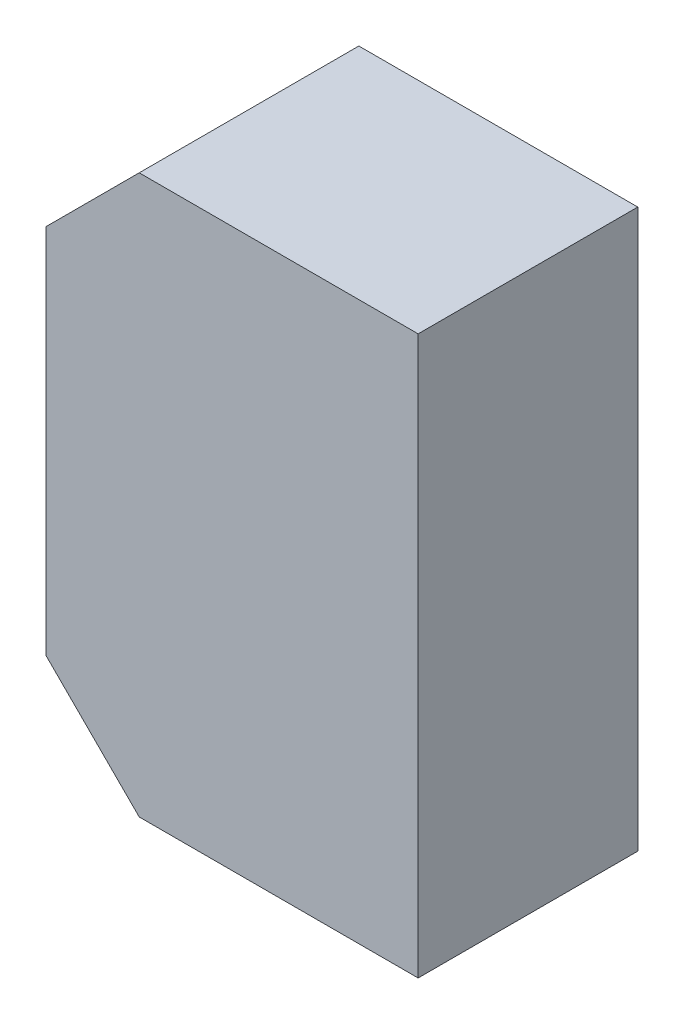
ISO-10303-21;
HEADER;
FILE_DESCRIPTION(('STEP AP214'),'2;1');
FILE_NAME('part.step','',(''),(''),'','','');
FILE_SCHEMA(('AUTOMOTIVE_DESIGN { 1 0 10303 214 1 1 1 1 }'));
ENDSEC;
DATA;
#1=APPLICATION_CONTEXT('core data for automotive mechanical design processes');
#2=APPLICATION_PROTOCOL_DEFINITION('international standard','automotive_design',2000,#1);
#3=PRODUCT_CONTEXT('',#1,'mechanical');
#4=PRODUCT('Part','Part','',(#3));
#5=PRODUCT_RELATED_PRODUCT_CATEGORY('part','',(#4));
#6=PRODUCT_DEFINITION_FORMATION('','',#4);
#7=PRODUCT_DEFINITION_CONTEXT('part definition',#1,'design');
#8=PRODUCT_DEFINITION('design','',#6,#7);
#9=PRODUCT_DEFINITION_SHAPE('','',#8);
#10=(LENGTH_UNIT() NAMED_UNIT(*) SI_UNIT(.MILLI.,.METRE.));
#11=(NAMED_UNIT(*) PLANE_ANGLE_UNIT() SI_UNIT($,.RADIAN.));
#12=(NAMED_UNIT(*) SI_UNIT($,.STERADIAN.) SOLID_ANGLE_UNIT());
#13=UNCERTAINTY_MEASURE_WITH_UNIT(LENGTH_MEASURE(1.E-05),#10,'distance_accuracy_value','');
#14=(GEOMETRIC_REPRESENTATION_CONTEXT(3) GLOBAL_UNCERTAINTY_ASSIGNED_CONTEXT((#13)) GLOBAL_UNIT_ASSIGNED_CONTEXT((#10,
#11,#12)) REPRESENTATION_CONTEXT('',''));
#15=CARTESIAN_POINT('',(0.,0.,0.));
#16=DIRECTION('',(0.,0.,1.));
#17=DIRECTION('',(1.,0.,0.));
#18=AXIS2_PLACEMENT_3D('',#15,#16,#17);
#19=CARTESIAN_POINT('',(2.54,1.27,5.));
#20=DIRECTION('',(0.,0.,-1.));
#21=DIRECTION('',(-1.,0.,0.));
#22=AXIS2_PLACEMENT_3D('',#19,#20,#21);
#23=PLANE('',#22);
#24=DIRECTION('',(0.707106781186548,0.707106781186548,0.));
#25=VECTOR('',#24,1.);
#26=CARTESIAN_POINT('',(-1.27,1.27,5.));
#27=LINE('',#26,#25);
#28=CARTESIAN_POINT('',(-1.27,1.27,5.));
#29=VERTEX_POINT('',#28);
#30=CARTESIAN_POINT('',(-2.54,0.,5.));
#31=VERTEX_POINT('',#30);
#32=EDGE_CURVE('E95',#29,#31,#27,.F.);
#33=ORIENTED_EDGE('',*,*,#32,.T.);
#34=DIRECTION('',(0.,1.,0.));
#35=VECTOR('',#34,1.);
#36=CARTESIAN_POINT('',(-2.54,0.,5.));
#37=LINE('',#36,#35);
#38=CARTESIAN_POINT('',(-2.54,-5.08,5.));
#39=VERTEX_POINT('',#38);
#40=EDGE_CURVE('E91',#31,#39,#37,.F.);
#41=ORIENTED_EDGE('',*,*,#40,.T.);
#42=DIRECTION('',(-0.707106781186548,0.707106781186548,0.));
#43=VECTOR('',#42,1.);
#44=CARTESIAN_POINT('',(-2.54,-5.08,5.));
#45=LINE('',#44,#43);
#46=CARTESIAN_POINT('',(-1.27,-6.35,5.));
#47=VERTEX_POINT('',#46);
#48=EDGE_CURVE('E67',#39,#47,#45,.F.);
#49=ORIENTED_EDGE('',*,*,#48,.T.);
#50=DIRECTION('',(1.,0.,0.));
#51=VECTOR('',#50,1.);
#52=CARTESIAN_POINT('',(-1.27,-6.35,5.));
#53=LINE('',#52,#51);
#54=CARTESIAN_POINT('',(2.54,-6.35,5.));
#55=VERTEX_POINT('',#54);
#56=EDGE_CURVE('E69',#47,#55,#53,.T.);
#57=ORIENTED_EDGE('',*,*,#56,.T.);
#58=DIRECTION('',(0.,1.,0.));
#59=VECTOR('',#58,1.);
#60=CARTESIAN_POINT('',(2.54,-6.35,5.));
#61=LINE('',#60,#59);
#62=CARTESIAN_POINT('',(2.54,1.27,5.));
#63=VERTEX_POINT('',#62);
#64=EDGE_CURVE('E19',#55,#63,#61,.T.);
#65=ORIENTED_EDGE('',*,*,#64,.T.);
#66=DIRECTION('',(1.,0.,0.));
#67=VECTOR('',#66,1.);
#68=CARTESIAN_POINT('',(2.54,1.27,5.));
#69=LINE('',#68,#67);
#70=EDGE_CURVE('E100',#63,#29,#69,.F.);
#71=ORIENTED_EDGE('',*,*,#70,.T.);
#72=EDGE_LOOP('',(#33,#41,#49,#57,#65,#71));
#73=FACE_BOUND('',#72,.T.);
#74=ADVANCED_FACE('F16',(#73),#23,.F.);
#75=CARTESIAN_POINT('',(2.54,-6.35,2.));
#76=DIRECTION('',(-1.,0.,0.));
#77=DIRECTION('',(0.,0.,1.));
#78=AXIS2_PLACEMENT_3D('',#75,#76,#77);
#79=PLANE('',#78);
#80=DIRECTION('',(0.,0.,-1.));
#81=VECTOR('',#80,1.);
#82=CARTESIAN_POINT('',(2.54,1.27,2.));
#83=LINE('',#82,#81);
#84=CARTESIAN_POINT('',(2.54,1.27,2.));
#85=VERTEX_POINT('',#84);
#86=EDGE_CURVE('E80',#85,#63,#83,.F.);
#87=ORIENTED_EDGE('',*,*,#86,.T.);
#88=ORIENTED_EDGE('',*,*,#64,.F.);
#89=DIRECTION('',(0.,0.,1.));
#90=VECTOR('',#89,1.);
#91=CARTESIAN_POINT('',(2.54,-6.35,2.));
#92=LINE('',#91,#90);
#93=CARTESIAN_POINT('',(2.54,-6.35,2.));
#94=VERTEX_POINT('',#93);
#95=EDGE_CURVE('E75',#55,#94,#92,.F.);
#96=ORIENTED_EDGE('',*,*,#95,.T.);
#97=DIRECTION('',(0.,1.,0.));
#98=VECTOR('',#97,1.);
#99=CARTESIAN_POINT('',(2.54,1.27,2.));
#100=LINE('',#99,#98);
#101=EDGE_CURVE('E103',#85,#94,#100,.F.);
#102=ORIENTED_EDGE('',*,*,#101,.F.);
#103=EDGE_LOOP('',(#87,#88,#96,#102));
#104=FACE_BOUND('',#103,.T.);
#105=ADVANCED_FACE('F77',(#104),#79,.F.);
#106=CARTESIAN_POINT('',(-1.27,-6.35,2.));
#107=DIRECTION('',(0.,1.,0.));
#108=DIRECTION('',(0.,0.,1.));
#109=AXIS2_PLACEMENT_3D('',#106,#107,#108);
#110=PLANE('',#109);
#111=ORIENTED_EDGE('',*,*,#95,.F.);
#112=ORIENTED_EDGE('',*,*,#56,.F.);
#113=DIRECTION('',(0.,0.,1.));
#114=VECTOR('',#113,1.);
#115=CARTESIAN_POINT('',(-1.27,-6.35,2.));
#116=LINE('',#115,#114);
#117=CARTESIAN_POINT('',(-1.27,-6.35,2.));
#118=VERTEX_POINT('',#117);
#119=EDGE_CURVE('E87',#47,#118,#116,.F.);
#120=ORIENTED_EDGE('',*,*,#119,.T.);
#121=DIRECTION('',(-1.,0.,0.));
#122=VECTOR('',#121,1.);
#123=CARTESIAN_POINT('',(2.54,-6.35,2.));
#124=LINE('',#123,#122);
#125=EDGE_CURVE('E84',#94,#118,#124,.T.);
#126=ORIENTED_EDGE('',*,*,#125,.F.);
#127=EDGE_LOOP('',(#111,#112,#120,#126));
#128=FACE_BOUND('',#127,.T.);
#129=ADVANCED_FACE('F82',(#128),#110,.F.);
#130=CARTESIAN_POINT('',(-2.54,-5.08,2.));
#131=DIRECTION('',(0.707106781186548,0.707106781186548,0.));
#132=DIRECTION('',(-0.707106781186548,0.707106781186548,0.));
#133=AXIS2_PLACEMENT_3D('',#130,#131,#132);
#134=PLANE('',#133);
#135=ORIENTED_EDGE('',*,*,#119,.F.);
#136=ORIENTED_EDGE('',*,*,#48,.F.);
#137=DIRECTION('',(0.,0.,-1.));
#138=VECTOR('',#137,1.);
#139=CARTESIAN_POINT('',(-2.54,-5.08,2.));
#140=LINE('',#139,#138);
#141=CARTESIAN_POINT('',(-2.54,-5.08,2.));
#142=VERTEX_POINT('',#141);
#143=EDGE_CURVE('E93',#39,#142,#140,.T.);
#144=ORIENTED_EDGE('',*,*,#143,.T.);
#145=DIRECTION('',(-0.707106781186548,0.707106781186547,0.));
#146=VECTOR('',#145,1.);
#147=CARTESIAN_POINT('',(-1.27,-6.35,2.));
#148=LINE('',#147,#146);
#149=EDGE_CURVE('E106',#118,#142,#148,.T.);
#150=ORIENTED_EDGE('',*,*,#149,.F.);
#151=EDGE_LOOP('',(#135,#136,#144,#150));
#152=FACE_BOUND('',#151,.T.);
#153=ADVANCED_FACE('F123',(#152),#134,.F.);
#154=CARTESIAN_POINT('',(-2.54,0.,2.));
#155=DIRECTION('',(1.,0.,0.));
#156=DIRECTION('',(0.,0.,-1.));
#157=AXIS2_PLACEMENT_3D('',#154,#155,#156);
#158=PLANE('',#157);
#159=ORIENTED_EDGE('',*,*,#143,.F.);
#160=ORIENTED_EDGE('',*,*,#40,.F.);
#161=DIRECTION('',(0.,0.,1.));
#162=VECTOR('',#161,1.);
#163=CARTESIAN_POINT('',(-2.54,0.,2.));
#164=LINE('',#163,#162);
#165=CARTESIAN_POINT('',(-2.54,0.,2.));
#166=VERTEX_POINT('',#165);
#167=EDGE_CURVE('E97',#31,#166,#164,.F.);
#168=ORIENTED_EDGE('',*,*,#167,.T.);
#169=DIRECTION('',(0.,1.,0.));
#170=VECTOR('',#169,1.);
#171=CARTESIAN_POINT('',(-2.54,1.27,2.));
#172=LINE('',#171,#170);
#173=EDGE_CURVE('E109',#142,#166,#172,.T.);
#174=ORIENTED_EDGE('',*,*,#173,.F.);
#175=EDGE_LOOP('',(#159,#160,#168,#174));
#176=FACE_BOUND('',#175,.T.);
#177=ADVANCED_FACE('F121',(#176),#158,.F.);
#178=CARTESIAN_POINT('',(-1.27,1.27,2.));
#179=DIRECTION('',(0.707106781186548,-0.707106781186548,0.));
#180=DIRECTION('',(0.707106781186548,0.707106781186548,0.));
#181=AXIS2_PLACEMENT_3D('',#178,#179,#180);
#182=PLANE('',#181);
#183=ORIENTED_EDGE('',*,*,#167,.F.);
#184=ORIENTED_EDGE('',*,*,#32,.F.);
#185=DIRECTION('',(0.,0.,-1.));
#186=VECTOR('',#185,1.);
#187=CARTESIAN_POINT('',(-1.27,1.27,2.));
#188=LINE('',#187,#186);
#189=CARTESIAN_POINT('',(-1.27,1.27,2.));
#190=VERTEX_POINT('',#189);
#191=EDGE_CURVE('E34',#29,#190,#188,.T.);
#192=ORIENTED_EDGE('',*,*,#191,.T.);
#193=DIRECTION('',(0.707106781186548,0.707106781186547,0.));
#194=VECTOR('',#193,1.);
#195=CARTESIAN_POINT('',(-2.54,0.,2.));
#196=LINE('',#195,#194);
#197=EDGE_CURVE('E25',#166,#190,#196,.T.);
#198=ORIENTED_EDGE('',*,*,#197,.F.);
#199=EDGE_LOOP('',(#183,#184,#192,#198));
#200=FACE_BOUND('',#199,.T.);
#201=ADVANCED_FACE('F117',(#200),#182,.F.);
#202=CARTESIAN_POINT('',(2.54,1.27,2.));
#203=DIRECTION('',(0.,-1.,0.));
#204=DIRECTION('',(0.,0.,-1.));
#205=AXIS2_PLACEMENT_3D('',#202,#203,#204);
#206=PLANE('',#205);
#207=ORIENTED_EDGE('',*,*,#191,.F.);
#208=ORIENTED_EDGE('',*,*,#70,.F.);
#209=ORIENTED_EDGE('',*,*,#86,.F.);
#210=DIRECTION('',(-1.,0.,0.));
#211=VECTOR('',#210,1.);
#212=CARTESIAN_POINT('',(2.54,1.27,2.));
#213=LINE('',#212,#211);
#214=EDGE_CURVE('E11',#190,#85,#213,.F.);
#215=ORIENTED_EDGE('',*,*,#214,.F.);
#216=EDGE_LOOP('',(#207,#208,#209,#215));
#217=FACE_BOUND('',#216,.T.);
#218=ADVANCED_FACE('F126',(#217),#206,.F.);
#219=CARTESIAN_POINT('',(2.54,1.27,2.));
#220=DIRECTION('',(0.,0.,-1.));
#221=DIRECTION('',(-1.,0.,0.));
#222=AXIS2_PLACEMENT_3D('',#219,#220,#221);
#223=PLANE('',#222);
#224=ORIENTED_EDGE('',*,*,#197,.T.);
#225=ORIENTED_EDGE('',*,*,#214,.T.);
#226=ORIENTED_EDGE('',*,*,#101,.T.);
#227=ORIENTED_EDGE('',*,*,#125,.T.);
#228=ORIENTED_EDGE('',*,*,#149,.T.);
#229=ORIENTED_EDGE('',*,*,#173,.T.);
#230=EDGE_LOOP('',(#224,#225,#226,#227,#228,#229));
#231=FACE_BOUND('',#230,.T.);
#232=ADVANCED_FACE('F114',(#231),#223,.T.);
#233=CLOSED_SHELL('',(#74,#105,#129,#153,#177,#201,#218,#232));
#234=MANIFOLD_SOLID_BREP('B1',#233);
#235=ADVANCED_BREP_SHAPE_REPRESENTATION('',(#18,#234),#14);
#236=SHAPE_DEFINITION_REPRESENTATION(#9,#235);
ENDSEC;
END-ISO-10303-21;
